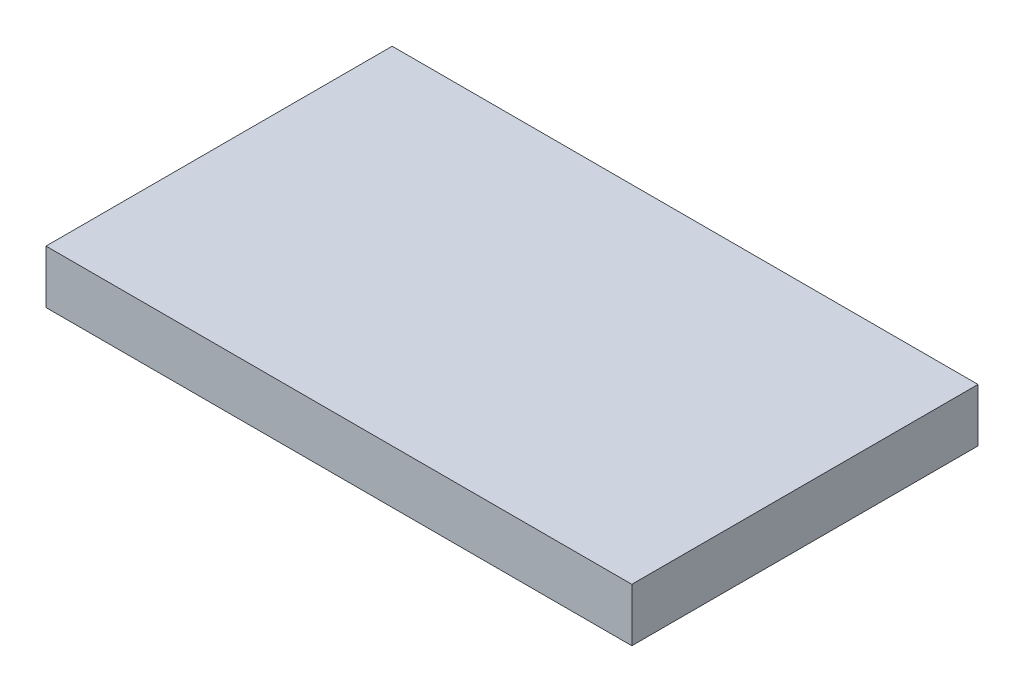
ISO-10303-21;
HEADER;
FILE_DESCRIPTION(('STEP AP214'),'2;1');
FILE_NAME('part.step','',(''),(''),'','','');
FILE_SCHEMA(('AUTOMOTIVE_DESIGN { 1 0 10303 214 1 1 1 1 }'));
ENDSEC;
DATA;
#1=APPLICATION_CONTEXT('core data for automotive mechanical design processes');
#2=APPLICATION_PROTOCOL_DEFINITION('international standard','automotive_design',2000,#1);
#3=PRODUCT_CONTEXT('',#1,'mechanical');
#4=PRODUCT('Part','Part','',(#3));
#5=PRODUCT_RELATED_PRODUCT_CATEGORY('part','',(#4));
#6=PRODUCT_DEFINITION_FORMATION('','',#4);
#7=PRODUCT_DEFINITION_CONTEXT('part definition',#1,'design');
#8=PRODUCT_DEFINITION('design','',#6,#7);
#9=PRODUCT_DEFINITION_SHAPE('','',#8);
#10=(LENGTH_UNIT() NAMED_UNIT(*) SI_UNIT(.MILLI.,.METRE.));
#11=(NAMED_UNIT(*) PLANE_ANGLE_UNIT() SI_UNIT($,.RADIAN.));
#12=(NAMED_UNIT(*) SI_UNIT($,.STERADIAN.) SOLID_ANGLE_UNIT());
#13=UNCERTAINTY_MEASURE_WITH_UNIT(LENGTH_MEASURE(1.E-05),#10,'distance_accuracy_value','');
#14=(GEOMETRIC_REPRESENTATION_CONTEXT(3) GLOBAL_UNCERTAINTY_ASSIGNED_CONTEXT((#13)) GLOBAL_UNIT_ASSIGNED_CONTEXT((#10,
#11,#12)) REPRESENTATION_CONTEXT('',''));
#15=CARTESIAN_POINT('',(0.,0.,0.));
#16=DIRECTION('',(0.,0.,1.));
#17=DIRECTION('',(1.,0.,0.));
#18=AXIS2_PLACEMENT_3D('',#15,#16,#17);
#19=CARTESIAN_POINT('',(11.,1.,-6.5));
#20=DIRECTION('',(-1.,0.,0.));
#21=DIRECTION('',(0.,0.,1.));
#22=AXIS2_PLACEMENT_3D('',#19,#20,#21);
#23=PLANE('',#22);
#24=DIRECTION('',(0.,0.,-1.));
#25=VECTOR('',#24,1.);
#26=CARTESIAN_POINT('',(11.,-1.,-6.5));
#27=LINE('',#26,#25);
#28=CARTESIAN_POINT('',(11.,-1.,6.5));
#29=VERTEX_POINT('',#28);
#30=CARTESIAN_POINT('',(11.,-1.,-6.5));
#31=VERTEX_POINT('',#30);
#32=EDGE_CURVE('E105',#29,#31,#27,.T.);
#33=ORIENTED_EDGE('',*,*,#32,.T.);
#34=DIRECTION('',(0.,-1.,0.));
#35=VECTOR('',#34,1.);
#36=CARTESIAN_POINT('',(11.,1.,-6.5));
#37=LINE('',#36,#35);
#38=CARTESIAN_POINT('',(11.,1.,-6.5));
#39=VERTEX_POINT('',#38);
#40=EDGE_CURVE('E11',#39,#31,#37,.T.);
#41=ORIENTED_EDGE('',*,*,#40,.F.);
#42=DIRECTION('',(0.,0.,-1.));
#43=VECTOR('',#42,1.);
#44=CARTESIAN_POINT('',(11.,1.,-6.5));
#45=LINE('',#44,#43);
#46=CARTESIAN_POINT('',(11.,1.,6.5));
#47=VERTEX_POINT('',#46);
#48=EDGE_CURVE('E89',#47,#39,#45,.T.);
#49=ORIENTED_EDGE('',*,*,#48,.F.);
#50=DIRECTION('',(0.,-1.,0.));
#51=VECTOR('',#50,1.);
#52=CARTESIAN_POINT('',(11.,1.,6.5));
#53=LINE('',#52,#51);
#54=EDGE_CURVE('E97',#47,#29,#53,.T.);
#55=ORIENTED_EDGE('',*,*,#54,.T.);
#56=EDGE_LOOP('',(#33,#41,#49,#55));
#57=FACE_BOUND('',#56,.T.);
#58=ADVANCED_FACE('F39',(#57),#23,.F.);
#59=CARTESIAN_POINT('',(-11.,1.,-6.5));
#60=DIRECTION('',(0.,0.,1.));
#61=DIRECTION('',(1.,0.,0.));
#62=AXIS2_PLACEMENT_3D('',#59,#60,#61);
#63=PLANE('',#62);
#64=DIRECTION('',(-1.,0.,0.));
#65=VECTOR('',#64,1.);
#66=CARTESIAN_POINT('',(-11.,-1.,-6.5));
#67=LINE('',#66,#65);
#68=CARTESIAN_POINT('',(-11.,-1.,-6.5));
#69=VERTEX_POINT('',#68);
#70=EDGE_CURVE('E92',#31,#69,#67,.T.);
#71=ORIENTED_EDGE('',*,*,#70,.T.);
#72=DIRECTION('',(0.,-1.,0.));
#73=VECTOR('',#72,1.);
#74=CARTESIAN_POINT('',(-11.,1.,-6.5));
#75=LINE('',#74,#73);
#76=CARTESIAN_POINT('',(-11.,1.,-6.5));
#77=VERTEX_POINT('',#76);
#78=EDGE_CURVE('E50',#77,#69,#75,.T.);
#79=ORIENTED_EDGE('',*,*,#78,.F.);
#80=DIRECTION('',(-1.,0.,0.));
#81=VECTOR('',#80,1.);
#82=CARTESIAN_POINT('',(-11.,1.,-6.5));
#83=LINE('',#82,#81);
#84=EDGE_CURVE('E82',#39,#77,#83,.T.);
#85=ORIENTED_EDGE('',*,*,#84,.F.);
#86=ORIENTED_EDGE('',*,*,#40,.T.);
#87=EDGE_LOOP('',(#71,#79,#85,#86));
#88=FACE_BOUND('',#87,.T.);
#89=ADVANCED_FACE('F93',(#88),#63,.F.);
#90=CARTESIAN_POINT('',(-11.,1.,-6.5));
#91=DIRECTION('',(1.,0.,0.));
#92=DIRECTION('',(0.,0.,-1.));
#93=AXIS2_PLACEMENT_3D('',#90,#91,#92);
#94=PLANE('',#93);
#95=DIRECTION('',(0.,0.,1.));
#96=VECTOR('',#95,1.);
#97=CARTESIAN_POINT('',(-11.,-1.,-6.5));
#98=LINE('',#97,#96);
#99=CARTESIAN_POINT('',(-11.,-1.,6.5));
#100=VERTEX_POINT('',#99);
#101=EDGE_CURVE('E75',#69,#100,#98,.T.);
#102=ORIENTED_EDGE('',*,*,#101,.T.);
#103=DIRECTION('',(0.,-1.,0.));
#104=VECTOR('',#103,1.);
#105=CARTESIAN_POINT('',(-11.,1.,6.5));
#106=LINE('',#105,#104);
#107=CARTESIAN_POINT('',(-11.,1.,6.5));
#108=VERTEX_POINT('',#107);
#109=EDGE_CURVE('E94',#108,#100,#106,.T.);
#110=ORIENTED_EDGE('',*,*,#109,.F.);
#111=DIRECTION('',(0.,0.,1.));
#112=VECTOR('',#111,1.);
#113=CARTESIAN_POINT('',(-11.,1.,-6.5));
#114=LINE('',#113,#112);
#115=EDGE_CURVE('E88',#77,#108,#114,.T.);
#116=ORIENTED_EDGE('',*,*,#115,.F.);
#117=ORIENTED_EDGE('',*,*,#78,.T.);
#118=EDGE_LOOP('',(#102,#110,#116,#117));
#119=FACE_BOUND('',#118,.T.);
#120=ADVANCED_FACE('F96',(#119),#94,.F.);
#121=CARTESIAN_POINT('',(-11.,1.,6.5));
#122=DIRECTION('',(0.,0.,-1.));
#123=DIRECTION('',(-1.,0.,0.));
#124=AXIS2_PLACEMENT_3D('',#121,#122,#123);
#125=PLANE('',#124);
#126=DIRECTION('',(1.,0.,0.));
#127=VECTOR('',#126,1.);
#128=CARTESIAN_POINT('',(-11.,-1.,6.5));
#129=LINE('',#128,#127);
#130=EDGE_CURVE('E76',#100,#29,#129,.T.);
#131=ORIENTED_EDGE('',*,*,#130,.T.);
#132=ORIENTED_EDGE('',*,*,#54,.F.);
#133=DIRECTION('',(1.,0.,0.));
#134=VECTOR('',#133,1.);
#135=CARTESIAN_POINT('',(-11.,1.,6.5));
#136=LINE('',#135,#134);
#137=EDGE_CURVE('E54',#108,#47,#136,.T.);
#138=ORIENTED_EDGE('',*,*,#137,.F.);
#139=ORIENTED_EDGE('',*,*,#109,.T.);
#140=EDGE_LOOP('',(#131,#132,#138,#139));
#141=FACE_BOUND('',#140,.T.);
#142=ADVANCED_FACE('F107',(#141),#125,.F.);
#143=CARTESIAN_POINT('',(0.,1.,0.));
#144=DIRECTION('',(0.,1.,0.));
#145=DIRECTION('',(0.,0.,1.));
#146=AXIS2_PLACEMENT_3D('',#143,#144,#145);
#147=PLANE('',#146);
#148=ORIENTED_EDGE('',*,*,#48,.T.);
#149=ORIENTED_EDGE('',*,*,#84,.T.);
#150=ORIENTED_EDGE('',*,*,#115,.T.);
#151=ORIENTED_EDGE('',*,*,#137,.T.);
#152=EDGE_LOOP('',(#148,#149,#150,#151));
#153=FACE_BOUND('',#152,.T.);
#154=ADVANCED_FACE('F86',(#153),#147,.T.);
#155=CARTESIAN_POINT('',(0.,-1.,0.));
#156=DIRECTION('',(0.,1.,0.));
#157=DIRECTION('',(0.,0.,1.));
#158=AXIS2_PLACEMENT_3D('',#155,#156,#157);
#159=PLANE('',#158);
#160=ORIENTED_EDGE('',*,*,#32,.F.);
#161=ORIENTED_EDGE('',*,*,#130,.F.);
#162=ORIENTED_EDGE('',*,*,#101,.F.);
#163=ORIENTED_EDGE('',*,*,#70,.F.);
#164=EDGE_LOOP('',(#160,#161,#162,#163));
#165=FACE_BOUND('',#164,.T.);
#166=ADVANCED_FACE('F115',(#165),#159,.F.);
#167=CLOSED_SHELL('',(#58,#89,#120,#142,#154,#166));
#168=MANIFOLD_SOLID_BREP('B2',#167);
#169=ADVANCED_BREP_SHAPE_REPRESENTATION('',(#18,#168),#14);
#170=SHAPE_DEFINITION_REPRESENTATION(#9,#169);
ENDSEC;
END-ISO-10303-21;
